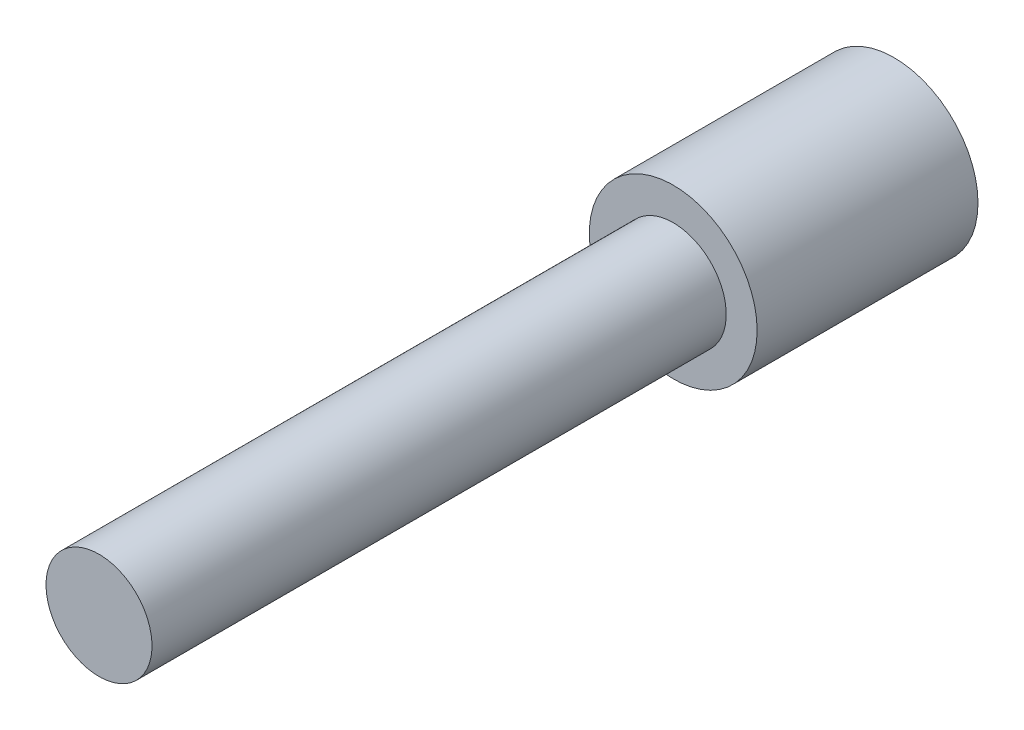
ISO-10303-21;
HEADER;
FILE_DESCRIPTION(('STEP AP214'),'2;1');
FILE_NAME('part.step','',(''),(''),'','','');
FILE_SCHEMA(('AUTOMOTIVE_DESIGN { 1 0 10303 214 1 1 1 1 }'));
ENDSEC;
DATA;
#1=APPLICATION_CONTEXT('core data for automotive mechanical design processes');
#2=APPLICATION_PROTOCOL_DEFINITION('international standard','automotive_design',2000,#1);
#3=PRODUCT_CONTEXT('',#1,'mechanical');
#4=PRODUCT('Part','Part','',(#3));
#5=PRODUCT_RELATED_PRODUCT_CATEGORY('part','',(#4));
#6=PRODUCT_DEFINITION_FORMATION('','',#4);
#7=PRODUCT_DEFINITION_CONTEXT('part definition',#1,'design');
#8=PRODUCT_DEFINITION('design','',#6,#7);
#9=PRODUCT_DEFINITION_SHAPE('','',#8);
#10=(LENGTH_UNIT() NAMED_UNIT(*) SI_UNIT(.MILLI.,.METRE.));
#11=(NAMED_UNIT(*) PLANE_ANGLE_UNIT() SI_UNIT($,.RADIAN.));
#12=(NAMED_UNIT(*) SI_UNIT($,.STERADIAN.) SOLID_ANGLE_UNIT());
#13=UNCERTAINTY_MEASURE_WITH_UNIT(LENGTH_MEASURE(1.E-05),#10,'distance_accuracy_value','');
#14=(GEOMETRIC_REPRESENTATION_CONTEXT(3) GLOBAL_UNCERTAINTY_ASSIGNED_CONTEXT((#13)) GLOBAL_UNIT_ASSIGNED_CONTEXT((#10,
#11,#12)) REPRESENTATION_CONTEXT('',''));
#15=CARTESIAN_POINT('',(0.,0.,0.));
#16=DIRECTION('',(0.,0.,1.));
#17=DIRECTION('',(1.,0.,0.));
#18=AXIS2_PLACEMENT_3D('',#15,#16,#17);
#19=CARTESIAN_POINT('',(0.,0.,90.));
#20=DIRECTION('',(0.,0.,-1.));
#21=DIRECTION('',(-1.,0.,0.));
#22=AXIS2_PLACEMENT_3D('',#19,#20,#21);
#23=CYLINDRICAL_SURFACE('',#22,6.);
#24=CARTESIAN_POINT('',(0.,0.,90.));
#25=DIRECTION('',(0.,0.,1.));
#26=DIRECTION('',(1.,0.,0.));
#27=AXIS2_PLACEMENT_3D('',#24,#25,#26);
#28=CIRCLE('',#27,6.);
#29=CARTESIAN_POINT('',(-6.,0.,90.));
#30=VERTEX_POINT('',#29);
#31=EDGE_CURVE('E44',#30,#30,#28,.T.);
#32=CARTESIAN_POINT('',(0.,0.,25.));
#33=DIRECTION('',(0.,0.,-1.));
#34=DIRECTION('',(-1.,0.,0.));
#35=AXIS2_PLACEMENT_3D('',#32,#33,#34);
#36=CIRCLE('',#35,6.);
#37=CARTESIAN_POINT('',(-6.,0.,25.));
#38=VERTEX_POINT('',#37);
#39=EDGE_CURVE('E10',#38,#38,#36,.T.);
#40=CARTESIAN_POINT('',(-6.,0.,90.));
#41=CARTESIAN_POINT('',(-6.,0.,89.3229166666667));
#42=CARTESIAN_POINT('',(-6.,0.,88.6458333333333));
#43=CARTESIAN_POINT('',(-6.,0.,87.2916666666667));
#44=CARTESIAN_POINT('',(-6.,0.,86.6145833333333));
#45=CARTESIAN_POINT('',(-6.,0.,85.2604166666667));
#46=CARTESIAN_POINT('',(-6.,0.,84.5833333333333));
#47=CARTESIAN_POINT('',(-6.,0.,83.2291666666667));
#48=CARTESIAN_POINT('',(-6.,0.,82.5520833333333));
#49=CARTESIAN_POINT('',(-6.,0.,81.1979166666667));
#50=CARTESIAN_POINT('',(-6.,0.,80.5208333333333));
#51=CARTESIAN_POINT('',(-6.,0.,79.1666666666667));
#52=CARTESIAN_POINT('',(-6.,0.,78.4895833333333));
#53=CARTESIAN_POINT('',(-6.,0.,77.1354166666667));
#54=CARTESIAN_POINT('',(-6.,0.,76.4583333333333));
#55=CARTESIAN_POINT('',(-6.,0.,75.1041666666667));
#56=CARTESIAN_POINT('',(-6.,0.,74.4270833333333));
#57=CARTESIAN_POINT('',(-6.,0.,73.0729166666667));
#58=CARTESIAN_POINT('',(-6.,0.,72.3958333333333));
#59=CARTESIAN_POINT('',(-6.,0.,71.0416666666667));
#60=CARTESIAN_POINT('',(-6.,0.,70.3645833333333));
#61=CARTESIAN_POINT('',(-6.,0.,69.0104166666667));
#62=CARTESIAN_POINT('',(-6.,0.,68.3333333333333));
#63=CARTESIAN_POINT('',(-6.,0.,66.9791666666667));
#64=CARTESIAN_POINT('',(-6.,0.,66.3020833333333));
#65=CARTESIAN_POINT('',(-6.,0.,64.9479166666667));
#66=CARTESIAN_POINT('',(-6.,0.,64.2708333333333));
#67=CARTESIAN_POINT('',(-6.,0.,62.9166666666667));
#68=CARTESIAN_POINT('',(-6.,0.,62.2395833333333));
#69=CARTESIAN_POINT('',(-6.,0.,60.8854166666667));
#70=CARTESIAN_POINT('',(-6.,0.,60.2083333333333));
#71=CARTESIAN_POINT('',(-6.,0.,58.8541666666667));
#72=CARTESIAN_POINT('',(-6.,0.,58.1770833333333));
#73=CARTESIAN_POINT('',(-6.,0.,56.8229166666667));
#74=CARTESIAN_POINT('',(-6.,0.,56.1458333333333));
#75=CARTESIAN_POINT('',(-6.,0.,54.7916666666667));
#76=CARTESIAN_POINT('',(-6.,0.,54.1145833333333));
#77=CARTESIAN_POINT('',(-6.,0.,52.7604166666667));
#78=CARTESIAN_POINT('',(-6.,0.,52.0833333333333));
#79=CARTESIAN_POINT('',(-6.,0.,50.7291666666667));
#80=CARTESIAN_POINT('',(-6.,0.,50.0520833333333));
#81=CARTESIAN_POINT('',(-6.,0.,48.6979166666667));
#82=CARTESIAN_POINT('',(-6.,0.,48.0208333333333));
#83=CARTESIAN_POINT('',(-6.,0.,46.6666666666667));
#84=CARTESIAN_POINT('',(-6.,0.,45.9895833333333));
#85=CARTESIAN_POINT('',(-6.,0.,44.6354166666667));
#86=CARTESIAN_POINT('',(-6.,0.,43.9583333333333));
#87=CARTESIAN_POINT('',(-6.,0.,42.6041666666667));
#88=CARTESIAN_POINT('',(-6.,0.,41.9270833333333));
#89=CARTESIAN_POINT('',(-6.,0.,40.5729166666667));
#90=CARTESIAN_POINT('',(-6.,0.,39.8958333333333));
#91=CARTESIAN_POINT('',(-6.,0.,38.5416666666667));
#92=CARTESIAN_POINT('',(-6.,0.,37.8645833333333));
#93=CARTESIAN_POINT('',(-6.,0.,36.5104166666667));
#94=CARTESIAN_POINT('',(-6.,0.,35.8333333333333));
#95=CARTESIAN_POINT('',(-6.,0.,34.4791666666667));
#96=CARTESIAN_POINT('',(-6.,0.,33.8020833333333));
#97=CARTESIAN_POINT('',(-6.,0.,32.4479166666667));
#98=CARTESIAN_POINT('',(-6.,0.,31.7708333333333));
#99=CARTESIAN_POINT('',(-6.,0.,30.4166666666667));
#100=CARTESIAN_POINT('',(-6.,0.,29.7395833333333));
#101=CARTESIAN_POINT('',(-6.,0.,28.3854166666667));
#102=CARTESIAN_POINT('',(-6.,0.,27.7083333333333));
#103=CARTESIAN_POINT('',(-6.,0.,26.3541666666667));
#104=CARTESIAN_POINT('',(-6.,0.,25.6770833333333));
#105=CARTESIAN_POINT('',(-6.,0.,25.));
#106=B_SPLINE_CURVE_WITH_KNOTS('',3,(#40,#41,#42,#43,#44,#45,#46,#47,#48,#49,#50,#51,#52,#53,
#54,#55,#56,#57,#58,#59,#60,#61,#62,#63,#64,#65,#66,#67,#68,#69,#70,#71,#72,#73,#74,#75,#76,#77,
#78,#79,#80,#81,#82,#83,#84,#85,#86,#87,#88,#89,#90,#91,#92,#93,#94,#95,#96,#97,#98,#99,#100,
#101,#102,#103,#104,#105),.UNSPECIFIED.,.F.,.F.,(4,2,2,2,2,2,2,2,2,2,2,2,2,2,2,2,2,2,2,2,2,2,2,
2,2,2,2,2,2,2,2,2,4),(0.,2.03125000000001,4.06250000000001,6.09375000000001,8.12500000000001,
10.15625,12.1875,14.21875,16.25,18.28125,20.3125,22.34375,24.375,26.40625,28.4375,30.46875,32.5,
34.53125,36.5625,38.59375,40.625,42.65625,44.6875,46.71875,48.75,50.78125,52.8125,54.84375,
56.875,58.90625,60.9375,62.96875,65.),.UNSPECIFIED.);
#107=EDGE_CURVE('BSEAM37',#30,#38,#106,.T.);
#108=ORIENTED_EDGE('',*,*,#31,.F.);
#109=ORIENTED_EDGE('',*,*,#39,.F.);
#110=ORIENTED_EDGE('',*,*,#107,.T.);
#111=ORIENTED_EDGE('',*,*,#107,.F.);
#112=EDGE_LOOP('',(#108,#110,#109,#111));
#113=FACE_BOUND('',#112,.T.);
#114=ADVANCED_FACE('F37',(#113),#23,.T.);
#115=CARTESIAN_POINT('',(0.,0.,90.));
#116=DIRECTION('',(0.,0.,1.));
#117=DIRECTION('',(1.,0.,0.));
#118=AXIS2_PLACEMENT_3D('',#115,#116,#117);
#119=PLANE('',#118);
#120=ORIENTED_EDGE('',*,*,#31,.T.);
#121=EDGE_LOOP('',(#120));
#122=FACE_BOUND('',#121,.T.);
#123=ADVANCED_FACE('F90',(#122),#119,.T.);
#124=CARTESIAN_POINT('',(0.,9.68166767612474,25.));
#125=DIRECTION('',(0.,0.,-1.));
#126=DIRECTION('',(-1.,0.,0.));
#127=AXIS2_PLACEMENT_3D('',#124,#125,#126);
#128=PLANE('',#127);
#129=ORIENTED_EDGE('',*,*,#39,.T.);
#130=EDGE_LOOP('',(#129));
#131=FACE_BOUND('',#130,.T.);
#132=CARTESIAN_POINT('',(0.,0.181667676124738,25.));
#133=DIRECTION('',(0.,0.,1.));
#134=DIRECTION('',(1.,0.,0.));
#135=AXIS2_PLACEMENT_3D('',#132,#133,#134);
#136=CIRCLE('',#135,9.5);
#137=CARTESIAN_POINT('',(9.5,0.181667676124738,25.));
#138=VERTEX_POINT('',#137);
#139=EDGE_CURVE('E54',#138,#138,#136,.T.);
#140=ORIENTED_EDGE('',*,*,#139,.T.);
#141=EDGE_LOOP('',(#140));
#142=FACE_BOUND('',#141,.T.);
#143=ADVANCED_FACE('F84',(#131,#142),#128,.F.);
#144=CARTESIAN_POINT('',(0.,0.181667676124738,35.2008498528515));
#145=DIRECTION('',(0.,0.,1.));
#146=DIRECTION('',(1.,0.,0.));
#147=AXIS2_PLACEMENT_3D('',#144,#145,#146);
#148=CYLINDRICAL_SURFACE('',#147,9.5);
#149=ORIENTED_EDGE('',*,*,#139,.F.);
#150=EDGE_LOOP('',(#149));
#151=FACE_BOUND('',#150,.T.);
#152=CARTESIAN_POINT('',(0.,0.181667676124738,0.));
#153=DIRECTION('',(0.,0.,1.));
#154=DIRECTION('',(1.,0.,0.));
#155=AXIS2_PLACEMENT_3D('',#152,#153,#154);
#156=CIRCLE('',#155,9.5);
#157=CARTESIAN_POINT('',(9.5,0.181667676124738,0.));
#158=VERTEX_POINT('',#157);
#159=EDGE_CURVE('E49',#158,#158,#156,.T.);
#160=ORIENTED_EDGE('',*,*,#159,.T.);
#161=EDGE_LOOP('',(#160));
#162=FACE_BOUND('',#161,.T.);
#163=ADVANCED_FACE('F80',(#151,#162),#148,.T.);
#164=CARTESIAN_POINT('',(0.,0.,0.));
#165=DIRECTION('',(0.,0.,1.));
#166=DIRECTION('',(1.,0.,0.));
#167=AXIS2_PLACEMENT_3D('',#164,#165,#166);
#168=PLANE('',#167);
#169=CARTESIAN_POINT('',(0.,0.,0.));
#170=DIRECTION('',(0.,0.,-1.));
#171=DIRECTION('',(-1.,0.,0.));
#172=AXIS2_PLACEMENT_3D('',#169,#170,#171);
#173=CIRCLE('',#172,7.5);
#174=CARTESIAN_POINT('',(-7.5,0.,0.));
#175=VERTEX_POINT('',#174);
#176=EDGE_CURVE('E61',#175,#175,#173,.T.);
#177=ORIENTED_EDGE('',*,*,#176,.F.);
#178=EDGE_LOOP('',(#177));
#179=FACE_BOUND('',#178,.T.);
#180=ORIENTED_EDGE('',*,*,#159,.F.);
#181=EDGE_LOOP('',(#180));
#182=FACE_BOUND('',#181,.T.);
#183=ADVANCED_FACE('F74',(#179,#182),#168,.F.);
#184=CARTESIAN_POINT('',(0.,0.,20.));
#185=DIRECTION('',(0.,0.,-1.));
#186=DIRECTION('',(-1.,0.,0.));
#187=AXIS2_PLACEMENT_3D('',#184,#185,#186);
#188=CYLINDRICAL_SURFACE('',#187,7.5);
#189=CARTESIAN_POINT('',(0.,0.,20.));
#190=DIRECTION('',(0.,0.,-1.));
#191=DIRECTION('',(-1.,0.,0.));
#192=AXIS2_PLACEMENT_3D('',#189,#190,#191);
#193=CIRCLE('',#192,7.5);
#194=CARTESIAN_POINT('',(-7.5,0.,20.));
#195=VERTEX_POINT('',#194);
#196=EDGE_CURVE('E60',#195,#195,#193,.T.);
#197=ORIENTED_EDGE('',*,*,#196,.F.);
#198=EDGE_LOOP('',(#197));
#199=FACE_BOUND('',#198,.T.);
#200=ORIENTED_EDGE('',*,*,#176,.T.);
#201=EDGE_LOOP('',(#200));
#202=FACE_BOUND('',#201,.T.);
#203=ADVANCED_FACE('F71',(#199,#202),#188,.F.);
#204=CARTESIAN_POINT('',(0.,0.,20.));
#205=DIRECTION('',(0.,0.,-1.));
#206=DIRECTION('',(-1.,0.,0.));
#207=AXIS2_PLACEMENT_3D('',#204,#205,#206);
#208=PLANE('',#207);
#209=ORIENTED_EDGE('',*,*,#196,.T.);
#210=EDGE_LOOP('',(#209));
#211=FACE_BOUND('',#210,.T.);
#212=ADVANCED_FACE('F69',(#211),#208,.T.);
#213=CLOSED_SHELL('',(#114,#123,#143,#163,#183,#203,#212));
#214=MANIFOLD_SOLID_BREP('B2',#213);
#215=ADVANCED_BREP_SHAPE_REPRESENTATION('',(#18,#214),#14);
#216=SHAPE_DEFINITION_REPRESENTATION(#9,#215);
ENDSEC;
END-ISO-10303-21;
